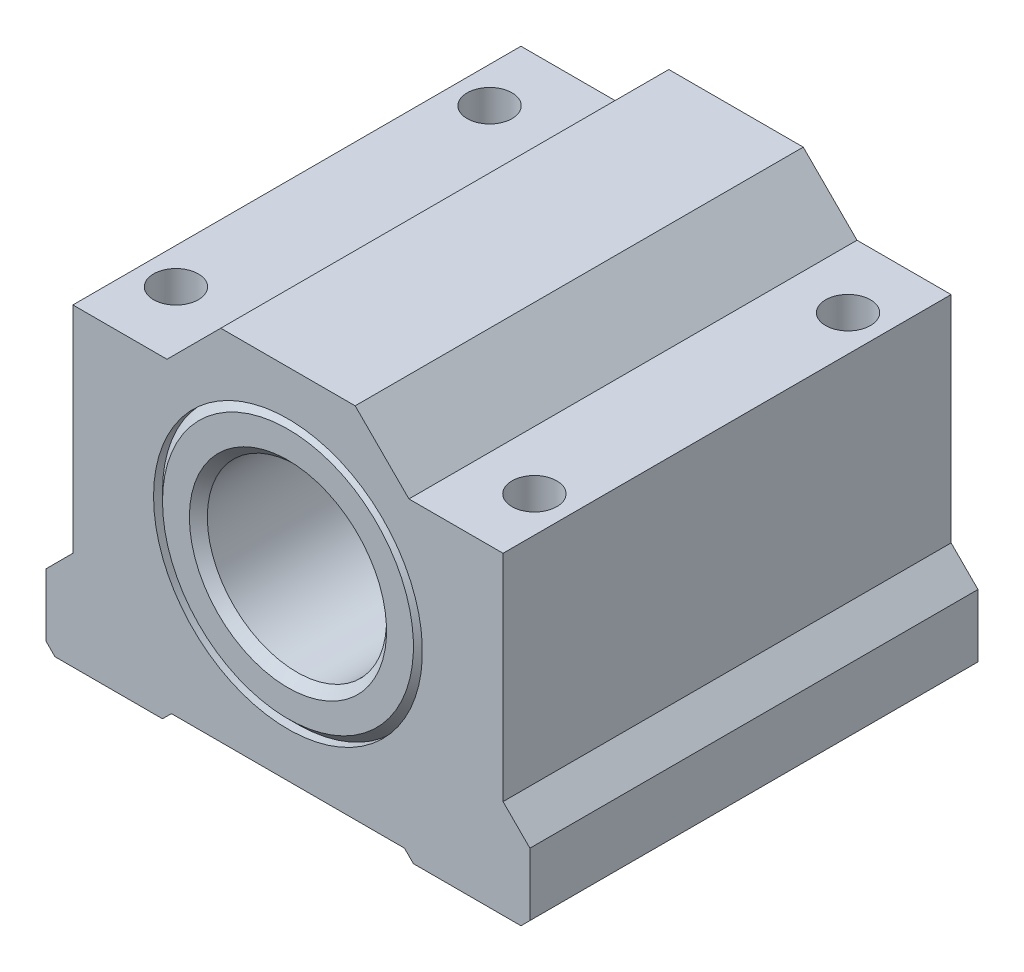
ISO-10303-21;
HEADER;
FILE_DESCRIPTION(('STEP AP214'),'2;1');
FILE_NAME('part.step','',(''),(''),'','','');
FILE_SCHEMA(('AUTOMOTIVE_DESIGN { 1 0 10303 214 1 1 1 1 }'));
ENDSEC;
DATA;
#1=APPLICATION_CONTEXT('core data for automotive mechanical design processes');
#2=APPLICATION_PROTOCOL_DEFINITION('international standard','automotive_design',2000,#1);
#3=PRODUCT_CONTEXT('',#1,'mechanical');
#4=PRODUCT('Part','Part','',(#3));
#5=PRODUCT_RELATED_PRODUCT_CATEGORY('part','',(#4));
#6=PRODUCT_DEFINITION_FORMATION('','',#4);
#7=PRODUCT_DEFINITION_CONTEXT('part definition',#1,'design');
#8=PRODUCT_DEFINITION('design','',#6,#7);
#9=PRODUCT_DEFINITION_SHAPE('','',#8);
#10=(LENGTH_UNIT() NAMED_UNIT(*) SI_UNIT(.MILLI.,.METRE.));
#11=(NAMED_UNIT(*) PLANE_ANGLE_UNIT() SI_UNIT($,.RADIAN.));
#12=(NAMED_UNIT(*) SI_UNIT($,.STERADIAN.) SOLID_ANGLE_UNIT());
#13=UNCERTAINTY_MEASURE_WITH_UNIT(LENGTH_MEASURE(1.E-05),#10,'distance_accuracy_value','');
#14=(GEOMETRIC_REPRESENTATION_CONTEXT(3) GLOBAL_UNCERTAINTY_ASSIGNED_CONTEXT((#13)) GLOBAL_UNIT_ASSIGNED_CONTEXT((#10,
#11,#12)) REPRESENTATION_CONTEXT('',''));
#15=CARTESIAN_POINT('',(0.,0.,0.));
#16=DIRECTION('',(0.,0.,1.));
#17=DIRECTION('',(1.,0.,0.));
#18=AXIS2_PLACEMENT_3D('',#15,#16,#17);
#19=CARTESIAN_POINT('',(0.,3.00000000000001,50.));
#20=DIRECTION('',(0.,0.,-1.));
#21=DIRECTION('',(-1.,0.,0.));
#22=AXIS2_PLACEMENT_3D('',#19,#20,#21);
#23=CYLINDRICAL_SURFACE('',#22,15.);
#24=CARTESIAN_POINT('',(0.,3.00000000000001,1.00000000000001));
#25=DIRECTION('',(0.,0.,-1.));
#26=DIRECTION('',(-1.,0.,0.));
#27=AXIS2_PLACEMENT_3D('',#24,#25,#26);
#28=CIRCLE('',#27,15.);
#29=CARTESIAN_POINT('',(-15.,3.00000000000001,1.00000000000001));
#30=VERTEX_POINT('',#29);
#31=EDGE_CURVE('E62',#30,#30,#28,.F.);
#32=ORIENTED_EDGE('',*,*,#31,.T.);
#33=EDGE_LOOP('',(#32));
#34=FACE_BOUND('',#33,.T.);
#35=CARTESIAN_POINT('',(0.,3.00000000000001,49.));
#36=DIRECTION('',(0.,0.,-1.));
#37=DIRECTION('',(-1.,0.,0.));
#38=AXIS2_PLACEMENT_3D('',#35,#36,#37);
#39=CIRCLE('',#38,15.);
#40=CARTESIAN_POINT('',(-15.,3.00000000000001,49.));
#41=VERTEX_POINT('',#40);
#42=EDGE_CURVE('E65',#41,#41,#39,.T.);
#43=ORIENTED_EDGE('',*,*,#42,.T.);
#44=EDGE_LOOP('',(#43));
#45=FACE_BOUND('',#44,.T.);
#46=ADVANCED_FACE('F42',(#34,#45),#23,.T.);
#47=CARTESIAN_POINT('',(0.,3.00000000000001,50.));
#48=DIRECTION('',(0.,0.,-1.));
#49=DIRECTION('',(-1.,0.,0.));
#50=AXIS2_PLACEMENT_3D('',#47,#48,#49);
#51=PLANE('',#50);
#52=CARTESIAN_POINT('',(0.,3.00000000000001,50.));
#53=DIRECTION('',(0.,0.,-1.));
#54=DIRECTION('',(-1.,0.,0.));
#55=AXIS2_PLACEMENT_3D('',#52,#53,#54);
#56=CIRCLE('',#55,11.);
#57=CARTESIAN_POINT('',(-11.,3.00000000000001,50.));
#58=VERTEX_POINT('',#57);
#59=EDGE_CURVE('E11',#58,#58,#56,.T.);
#60=ORIENTED_EDGE('',*,*,#59,.T.);
#61=EDGE_LOOP('',(#60));
#62=FACE_BOUND('',#61,.T.);
#63=CARTESIAN_POINT('',(0.,3.00000000000001,50.));
#64=DIRECTION('',(0.,0.,-1.));
#65=DIRECTION('',(-1.,0.,0.));
#66=AXIS2_PLACEMENT_3D('',#63,#64,#65);
#67=CIRCLE('',#66,14.);
#68=CARTESIAN_POINT('',(-14.,3.00000000000001,50.));
#69=VERTEX_POINT('',#68);
#70=EDGE_CURVE('E49',#69,#69,#67,.F.);
#71=ORIENTED_EDGE('',*,*,#70,.T.);
#72=EDGE_LOOP('',(#71));
#73=FACE_BOUND('',#72,.T.);
#74=ADVANCED_FACE('F98',(#62,#73),#51,.F.);
#75=CARTESIAN_POINT('',(0.,3.00000000000001,0.));
#76=DIRECTION('',(0.,0.,-1.));
#77=DIRECTION('',(-1.,0.,0.));
#78=AXIS2_PLACEMENT_3D('',#75,#76,#77);
#79=PLANE('',#78);
#80=CARTESIAN_POINT('',(0.,3.00000000000001,0.));
#81=DIRECTION('',(0.,0.,-1.));
#82=DIRECTION('',(-1.,0.,0.));
#83=AXIS2_PLACEMENT_3D('',#80,#81,#82);
#84=CIRCLE('',#83,14.);
#85=CARTESIAN_POINT('',(-14.,3.00000000000001,0.));
#86=VERTEX_POINT('',#85);
#87=EDGE_CURVE('E68',#86,#86,#84,.T.);
#88=ORIENTED_EDGE('',*,*,#87,.T.);
#89=EDGE_LOOP('',(#88));
#90=FACE_BOUND('',#89,.T.);
#91=CARTESIAN_POINT('',(0.,3.00000000000001,0.));
#92=DIRECTION('',(0.,0.,-1.));
#93=DIRECTION('',(-1.,0.,0.));
#94=AXIS2_PLACEMENT_3D('',#91,#92,#93);
#95=CIRCLE('',#94,11.);
#96=CARTESIAN_POINT('',(-11.,3.00000000000001,0.));
#97=VERTEX_POINT('',#96);
#98=EDGE_CURVE('E71',#97,#97,#95,.F.);
#99=ORIENTED_EDGE('',*,*,#98,.T.);
#100=EDGE_LOOP('',(#99));
#101=FACE_BOUND('',#100,.T.);
#102=ADVANCED_FACE('F75',(#90,#101),#79,.T.);
#103=CARTESIAN_POINT('',(0.,3.00000000000001,50.));
#104=DIRECTION('',(0.,0.,-1.));
#105=DIRECTION('',(-1.,0.,0.));
#106=AXIS2_PLACEMENT_3D('',#103,#104,#105);
#107=CYLINDRICAL_SURFACE('',#106,10.);
#108=CARTESIAN_POINT('',(0.,3.00000000000001,1.00000000000001));
#109=DIRECTION('',(0.,0.,-1.));
#110=DIRECTION('',(-1.,0.,0.));
#111=AXIS2_PLACEMENT_3D('',#108,#109,#110);
#112=CIRCLE('',#111,10.);
#113=CARTESIAN_POINT('',(-10.,3.00000000000001,1.00000000000001));
#114=VERTEX_POINT('',#113);
#115=EDGE_CURVE('E53',#114,#114,#112,.T.);
#116=ORIENTED_EDGE('',*,*,#115,.T.);
#117=EDGE_LOOP('',(#116));
#118=FACE_BOUND('',#117,.T.);
#119=CARTESIAN_POINT('',(0.,3.00000000000001,49.));
#120=DIRECTION('',(0.,0.,-1.));
#121=DIRECTION('',(-1.,0.,0.));
#122=AXIS2_PLACEMENT_3D('',#119,#120,#121);
#123=CIRCLE('',#122,10.);
#124=CARTESIAN_POINT('',(-10.,3.00000000000001,49.));
#125=VERTEX_POINT('',#124);
#126=EDGE_CURVE('E57',#125,#125,#123,.F.);
#127=ORIENTED_EDGE('',*,*,#126,.T.);
#128=EDGE_LOOP('',(#127));
#129=FACE_BOUND('',#128,.T.);
#130=ADVANCED_FACE('F85',(#118,#129),#107,.F.);
#131=CARTESIAN_POINT('',(0.,3.00000000000001,0.));
#132=DIRECTION('',(0.,0.,1.));
#133=DIRECTION('',(1.,0.,0.));
#134=AXIS2_PLACEMENT_3D('',#131,#132,#133);
#135=CONICAL_SURFACE('',#134,14.,0.785398163397449);
#136=ORIENTED_EDGE('',*,*,#31,.F.);
#137=EDGE_LOOP('',(#136));
#138=FACE_BOUND('',#137,.T.);
#139=ORIENTED_EDGE('',*,*,#87,.F.);
#140=EDGE_LOOP('',(#139));
#141=FACE_BOUND('',#140,.T.);
#142=ADVANCED_FACE('F81',(#138,#141),#135,.T.);
#143=CARTESIAN_POINT('',(0.,3.00000000000001,1.00000000000001));
#144=DIRECTION('',(0.,0.,-1.));
#145=DIRECTION('',(-1.,0.,0.));
#146=AXIS2_PLACEMENT_3D('',#143,#144,#145);
#147=CONICAL_SURFACE('',#146,10.,0.785398163397449);
#148=ORIENTED_EDGE('',*,*,#98,.F.);
#149=EDGE_LOOP('',(#148));
#150=FACE_BOUND('',#149,.T.);
#151=ORIENTED_EDGE('',*,*,#115,.F.);
#152=EDGE_LOOP('',(#151));
#153=FACE_BOUND('',#152,.T.);
#154=ADVANCED_FACE('F77',(#150,#153),#147,.F.);
#155=CARTESIAN_POINT('',(0.,3.00000000000001,50.));
#156=DIRECTION('',(0.,0.,1.));
#157=DIRECTION('',(1.,0.,0.));
#158=AXIS2_PLACEMENT_3D('',#155,#156,#157);
#159=CONICAL_SURFACE('',#158,11.,0.785398163397449);
#160=ORIENTED_EDGE('',*,*,#126,.F.);
#161=EDGE_LOOP('',(#160));
#162=FACE_BOUND('',#161,.T.);
#163=ORIENTED_EDGE('',*,*,#59,.F.);
#164=EDGE_LOOP('',(#163));
#165=FACE_BOUND('',#164,.T.);
#166=ADVANCED_FACE('F80',(#162,#165),#159,.F.);
#167=CARTESIAN_POINT('',(0.,3.00000000000001,49.));
#168=DIRECTION('',(0.,0.,-1.));
#169=DIRECTION('',(-1.,0.,0.));
#170=AXIS2_PLACEMENT_3D('',#167,#168,#169);
#171=CONICAL_SURFACE('',#170,15.,0.785398163397452);
#172=ORIENTED_EDGE('',*,*,#70,.F.);
#173=EDGE_LOOP('',(#172));
#174=FACE_BOUND('',#173,.T.);
#175=ORIENTED_EDGE('',*,*,#42,.F.);
#176=EDGE_LOOP('',(#175));
#177=FACE_BOUND('',#176,.T.);
#178=ADVANCED_FACE('F44',(#174,#177),#171,.T.);
#179=CLOSED_SHELL('',(#46,#74,#102,#130,#142,#154,#166,#178));
#180=MANIFOLD_SOLID_BREP('B2',#179);
#181=CARTESIAN_POINT('',(-24.,17.,50.));
#182=DIRECTION('',(0.,-1.,0.));
#183=DIRECTION('',(0.,0.,-1.));
#184=AXIS2_PLACEMENT_3D('',#181,#182,#183);
#185=PLANE('',#184);
#186=CARTESIAN_POINT('',(-20.,17.,7.5));
#187=DIRECTION('',(0.,-1.,0.));
#188=DIRECTION('',(0.,0.,-1.));
#189=AXIS2_PLACEMENT_3D('',#186,#187,#188);
#190=CIRCLE('',#189,2.5);
#191=CARTESIAN_POINT('',(-20.,17.,5.));
#192=VERTEX_POINT('',#191);
#193=EDGE_CURVE('E818',#192,#192,#190,.T.);
#194=ORIENTED_EDGE('',*,*,#193,.T.);
#195=EDGE_LOOP('',(#194));
#196=FACE_BOUND('',#195,.T.);
#197=CARTESIAN_POINT('',(-20.,17.,42.5));
#198=DIRECTION('',(0.,-1.,0.));
#199=DIRECTION('',(0.,0.,-1.));
#200=AXIS2_PLACEMENT_3D('',#197,#198,#199);
#201=CIRCLE('',#200,2.5);
#202=CARTESIAN_POINT('',(-20.,17.,40.));
#203=VERTEX_POINT('',#202);
#204=EDGE_CURVE('E445',#203,#203,#201,.T.);
#205=ORIENTED_EDGE('',*,*,#204,.T.);
#206=EDGE_LOOP('',(#205));
#207=FACE_BOUND('',#206,.T.);
#208=DIRECTION('',(0.,0.,1.));
#209=VECTOR('',#208,1.);
#210=CARTESIAN_POINT('',(-13.5,17.,0.));
#211=LINE('',#210,#209);
#212=CARTESIAN_POINT('',(-13.5,17.,0.));
#213=VERTEX_POINT('',#212);
#214=CARTESIAN_POINT('',(-13.5,17.,50.));
#215=VERTEX_POINT('',#214);
#216=EDGE_CURVE('E300',#213,#215,#211,.T.);
#217=ORIENTED_EDGE('',*,*,#216,.F.);
#218=DIRECTION('',(-1.,0.,0.));
#219=VECTOR('',#218,1.);
#220=CARTESIAN_POINT('',(-24.,17.,0.));
#221=LINE('',#220,#219);
#222=CARTESIAN_POINT('',(-24.,17.,0.));
#223=VERTEX_POINT('',#222);
#224=EDGE_CURVE('E312',#213,#223,#221,.T.);
#225=ORIENTED_EDGE('',*,*,#224,.T.);
#226=DIRECTION('',(0.,0.,-1.));
#227=VECTOR('',#226,1.);
#228=CARTESIAN_POINT('',(-24.,17.,50.));
#229=LINE('',#228,#227);
#230=CARTESIAN_POINT('',(-24.,17.,50.));
#231=VERTEX_POINT('',#230);
#232=EDGE_CURVE('E344',#231,#223,#229,.T.);
#233=ORIENTED_EDGE('',*,*,#232,.F.);
#234=DIRECTION('',(-1.,0.,0.));
#235=VECTOR('',#234,1.);
#236=CARTESIAN_POINT('',(-24.,17.,50.));
#237=LINE('',#236,#235);
#238=EDGE_CURVE('E314',#215,#231,#237,.T.);
#239=ORIENTED_EDGE('',*,*,#238,.F.);
#240=EDGE_LOOP('',(#217,#225,#233,#239));
#241=FACE_BOUND('',#240,.T.);
#242=ADVANCED_FACE('F169',(#196,#207,#241),#185,.F.);
#243=CARTESIAN_POINT('',(24.,-17.,50.));
#244=DIRECTION('',(-1.,0.,0.));
#245=DIRECTION('',(0.,0.,1.));
#246=AXIS2_PLACEMENT_3D('',#243,#244,#245);
#247=PLANE('',#246);
#248=DIRECTION('',(0.,1.,0.));
#249=VECTOR('',#248,1.);
#250=CARTESIAN_POINT('',(24.,-17.,50.));
#251=LINE('',#250,#249);
#252=CARTESIAN_POINT('',(24.,-6.99999999999998,50.));
#253=VERTEX_POINT('',#252);
#254=CARTESIAN_POINT('',(24.,17.,50.));
#255=VERTEX_POINT('',#254);
#256=EDGE_CURVE('E343',#253,#255,#251,.T.);
#257=ORIENTED_EDGE('',*,*,#256,.F.);
#258=DIRECTION('',(0.,0.,-1.));
#259=VECTOR('',#258,1.);
#260=CARTESIAN_POINT('',(24.,-6.99999999999998,50.));
#261=LINE('',#260,#259);
#262=CARTESIAN_POINT('',(24.,-6.99999999999998,0.));
#263=VERTEX_POINT('',#262);
#264=EDGE_CURVE('E505',#253,#263,#261,.T.);
#265=ORIENTED_EDGE('',*,*,#264,.T.);
#266=DIRECTION('',(0.,1.,0.));
#267=VECTOR('',#266,1.);
#268=CARTESIAN_POINT('',(24.,-17.,0.));
#269=LINE('',#268,#267);
#270=CARTESIAN_POINT('',(24.,17.,0.));
#271=VERTEX_POINT('',#270);
#272=EDGE_CURVE('E323',#263,#271,#269,.T.);
#273=ORIENTED_EDGE('',*,*,#272,.T.);
#274=DIRECTION('',(0.,0.,-1.));
#275=VECTOR('',#274,1.);
#276=CARTESIAN_POINT('',(24.,17.,50.));
#277=LINE('',#276,#275);
#278=EDGE_CURVE('E345',#255,#271,#277,.T.);
#279=ORIENTED_EDGE('',*,*,#278,.F.);
#280=EDGE_LOOP('',(#257,#265,#273,#279));
#281=FACE_BOUND('',#280,.T.);
#282=ADVANCED_FACE('F476',(#281),#247,.F.);
#283=CARTESIAN_POINT('',(20.,17.,42.5));
#284=DIRECTION('',(0.,-1.,0.));
#285=DIRECTION('',(0.,0.,-1.));
#286=AXIS2_PLACEMENT_3D('',#283,#284,#285);
#287=CIRCLE('',#286,2.5);
#288=CARTESIAN_POINT('',(20.,17.,40.));
#289=VERTEX_POINT('',#288);
#290=EDGE_CURVE('E497',#289,#289,#287,.T.);
#291=ORIENTED_EDGE('',*,*,#290,.T.);
#292=EDGE_LOOP('',(#291));
#293=FACE_BOUND('',#292,.T.);
#294=CARTESIAN_POINT('',(20.,17.,7.5));
#295=DIRECTION('',(0.,-1.,0.));
#296=DIRECTION('',(0.,0.,-1.));
#297=AXIS2_PLACEMENT_3D('',#294,#295,#296);
#298=CIRCLE('',#297,2.5);
#299=CARTESIAN_POINT('',(20.,17.,5.));
#300=VERTEX_POINT('',#299);
#301=EDGE_CURVE('E500',#300,#300,#298,.T.);
#302=ORIENTED_EDGE('',*,*,#301,.T.);
#303=EDGE_LOOP('',(#302));
#304=FACE_BOUND('',#303,.T.);
#305=CARTESIAN_POINT('',(13.5,17.,0.));
#306=VERTEX_POINT('',#305);
#307=EDGE_CURVE('E322',#271,#306,#221,.T.);
#308=ORIENTED_EDGE('',*,*,#307,.T.);
#309=DIRECTION('',(0.,0.,1.));
#310=VECTOR('',#309,1.);
#311=CARTESIAN_POINT('',(13.5,17.,0.));
#312=LINE('',#311,#310);
#313=CARTESIAN_POINT('',(13.5,17.,50.));
#314=VERTEX_POINT('',#313);
#315=EDGE_CURVE('E315',#306,#314,#312,.T.);
#316=ORIENTED_EDGE('',*,*,#315,.T.);
#317=EDGE_CURVE('E332',#255,#314,#237,.T.);
#318=ORIENTED_EDGE('',*,*,#317,.F.);
#319=ORIENTED_EDGE('',*,*,#278,.T.);
#320=EDGE_LOOP('',(#308,#316,#318,#319));
#321=FACE_BOUND('',#320,.T.);
#322=ADVANCED_FACE('F479',(#293,#304,#321),#185,.F.);
#323=CARTESIAN_POINT('',(-24.,-17.,50.));
#324=DIRECTION('',(1.,0.,0.));
#325=DIRECTION('',(0.,0.,-1.));
#326=AXIS2_PLACEMENT_3D('',#323,#324,#325);
#327=PLANE('',#326);
#328=DIRECTION('',(0.,-1.,0.));
#329=VECTOR('',#328,1.);
#330=CARTESIAN_POINT('',(-24.,-17.,0.));
#331=LINE('',#330,#329);
#332=CARTESIAN_POINT('',(-24.,-6.99999999999999,0.));
#333=VERTEX_POINT('',#332);
#334=EDGE_CURVE('E321',#223,#333,#331,.T.);
#335=ORIENTED_EDGE('',*,*,#334,.T.);
#336=DIRECTION('',(0.,0.,1.));
#337=VECTOR('',#336,1.);
#338=CARTESIAN_POINT('',(-24.,-6.99999999999999,50.));
#339=LINE('',#338,#337);
#340=CARTESIAN_POINT('',(-24.,-6.99999999999999,50.));
#341=VERTEX_POINT('',#340);
#342=EDGE_CURVE('E327',#333,#341,#339,.T.);
#343=ORIENTED_EDGE('',*,*,#342,.T.);
#344=DIRECTION('',(0.,-1.,0.));
#345=VECTOR('',#344,1.);
#346=CARTESIAN_POINT('',(-24.,-17.,50.));
#347=LINE('',#346,#345);
#348=EDGE_CURVE('E411',#231,#341,#347,.T.);
#349=ORIENTED_EDGE('',*,*,#348,.F.);
#350=ORIENTED_EDGE('',*,*,#232,.T.);
#351=EDGE_LOOP('',(#335,#343,#349,#350));
#352=FACE_BOUND('',#351,.T.);
#353=ADVANCED_FACE('F399',(#352),#327,.F.);
#354=CARTESIAN_POINT('',(-24.,-17.,50.));
#355=DIRECTION('',(0.,1.,0.));
#356=DIRECTION('',(0.,0.,1.));
#357=AXIS2_PLACEMENT_3D('',#354,#355,#356);
#358=PLANE('',#357);
#359=DIRECTION('',(1.,0.,0.));
#360=VECTOR('',#359,1.);
#361=CARTESIAN_POINT('',(-24.,-17.,0.));
#362=LINE('',#361,#360);
#363=CARTESIAN_POINT('',(-13.,-17.,0.));
#364=VERTEX_POINT('',#363);
#365=CARTESIAN_POINT('',(13.,-17.,0.));
#366=VERTEX_POINT('',#365);
#367=EDGE_CURVE('E340',#364,#366,#362,.T.);
#368=ORIENTED_EDGE('',*,*,#367,.T.);
#369=DIRECTION('',(0.,0.,1.));
#370=VECTOR('',#369,1.);
#371=CARTESIAN_POINT('',(13.,-17.,50.));
#372=LINE('',#371,#370);
#373=CARTESIAN_POINT('',(13.,-17.,50.));
#374=VERTEX_POINT('',#373);
#375=EDGE_CURVE('E517',#366,#374,#372,.T.);
#376=ORIENTED_EDGE('',*,*,#375,.T.);
#377=DIRECTION('',(1.,0.,0.));
#378=VECTOR('',#377,1.);
#379=CARTESIAN_POINT('',(-24.,-17.,50.));
#380=LINE('',#379,#378);
#381=CARTESIAN_POINT('',(-13.,-17.,50.));
#382=VERTEX_POINT('',#381);
#383=EDGE_CURVE('E346',#382,#374,#380,.T.);
#384=ORIENTED_EDGE('',*,*,#383,.F.);
#385=DIRECTION('',(0.,0.,-1.));
#386=VECTOR('',#385,1.);
#387=CARTESIAN_POINT('',(-13.,-17.,50.));
#388=LINE('',#387,#386);
#389=EDGE_CURVE('E403',#382,#364,#388,.T.);
#390=ORIENTED_EDGE('',*,*,#389,.T.);
#391=EDGE_LOOP('',(#368,#376,#384,#390));
#392=FACE_BOUND('',#391,.T.);
#393=ADVANCED_FACE('F493',(#392),#358,.F.);
#394=CARTESIAN_POINT('',(0.,0.,50.));
#395=DIRECTION('',(0.,0.,-1.));
#396=DIRECTION('',(-1.,0.,0.));
#397=AXIS2_PLACEMENT_3D('',#394,#395,#396);
#398=PLANE('',#397);
#399=CARTESIAN_POINT('',(0.,3.00000000000001,50.));
#400=DIRECTION('',(0.,0.,-1.));
#401=DIRECTION('',(-1.,0.,0.));
#402=AXIS2_PLACEMENT_3D('',#399,#400,#401);
#403=CIRCLE('',#402,15.);
#404=CARTESIAN_POINT('',(-15.,3.00000000000001,50.));
#405=VERTEX_POINT('',#404);
#406=EDGE_CURVE('E436',#405,#405,#403,.T.);
#407=ORIENTED_EDGE('',*,*,#406,.T.);
#408=EDGE_LOOP('',(#407));
#409=FACE_BOUND('',#408,.T.);
#410=ORIENTED_EDGE('',*,*,#348,.T.);
#411=DIRECTION('',(0.707106781186547,0.707106781186548,0.));
#412=VECTOR('',#411,1.);
#413=CARTESIAN_POINT('',(-24.,-6.99999999999999,50.));
#414=LINE('',#413,#412);
#415=CARTESIAN_POINT('',(-27.,-9.99999999999999,50.));
#416=VERTEX_POINT('',#415);
#417=EDGE_CURVE('E390',#341,#416,#414,.F.);
#418=ORIENTED_EDGE('',*,*,#417,.T.);
#419=DIRECTION('',(0.,-1.,0.));
#420=VECTOR('',#419,1.);
#421=CARTESIAN_POINT('',(-27.,-6.99999999999999,50.));
#422=LINE('',#421,#420);
#423=CARTESIAN_POINT('',(-27.,-17.,50.));
#424=VERTEX_POINT('',#423);
#425=EDGE_CURVE('E520',#416,#424,#422,.T.);
#426=ORIENTED_EDGE('',*,*,#425,.T.);
#427=DIRECTION('',(-0.707106781186548,0.707106781186548,0.));
#428=VECTOR('',#427,1.);
#429=CARTESIAN_POINT('',(-27.,-17.,50.));
#430=LINE('',#429,#428);
#431=CARTESIAN_POINT('',(-26.,-18.,50.));
#432=VERTEX_POINT('',#431);
#433=EDGE_CURVE('E365',#424,#432,#430,.F.);
#434=ORIENTED_EDGE('',*,*,#433,.T.);
#435=DIRECTION('',(1.,0.,0.));
#436=VECTOR('',#435,1.);
#437=CARTESIAN_POINT('',(-27.,-18.,50.));
#438=LINE('',#437,#436);
#439=CARTESIAN_POINT('',(-14.,-18.,50.));
#440=VERTEX_POINT('',#439);
#441=EDGE_CURVE('E522',#432,#440,#438,.T.);
#442=ORIENTED_EDGE('',*,*,#441,.T.);
#443=DIRECTION('',(-0.707106781186545,-0.70710678118655,0.));
#444=VECTOR('',#443,1.);
#445=CARTESIAN_POINT('',(-14.,-18.,50.));
#446=LINE('',#445,#444);
#447=EDGE_CURVE('E353',#440,#382,#446,.F.);
#448=ORIENTED_EDGE('',*,*,#447,.T.);
#449=ORIENTED_EDGE('',*,*,#383,.T.);
#450=DIRECTION('',(-0.70710678118655,0.707106781186545,0.));
#451=VECTOR('',#450,1.);
#452=CARTESIAN_POINT('',(13.,-17.,50.));
#453=LINE('',#452,#451);
#454=CARTESIAN_POINT('',(14.,-18.,50.));
#455=VERTEX_POINT('',#454);
#456=EDGE_CURVE('E356',#374,#455,#453,.F.);
#457=ORIENTED_EDGE('',*,*,#456,.T.);
#458=DIRECTION('',(1.,0.,0.));
#459=VECTOR('',#458,1.);
#460=CARTESIAN_POINT('',(13.,-18.,50.));
#461=LINE('',#460,#459);
#462=CARTESIAN_POINT('',(26.,-18.,50.));
#463=VERTEX_POINT('',#462);
#464=EDGE_CURVE('E451',#455,#463,#461,.T.);
#465=ORIENTED_EDGE('',*,*,#464,.T.);
#466=DIRECTION('',(-0.707106781186545,-0.70710678118655,0.));
#467=VECTOR('',#466,1.);
#468=CARTESIAN_POINT('',(26.,-18.,50.));
#469=LINE('',#468,#467);
#470=CARTESIAN_POINT('',(27.,-17.,50.));
#471=VERTEX_POINT('',#470);
#472=EDGE_CURVE('E363',#463,#471,#469,.F.);
#473=ORIENTED_EDGE('',*,*,#472,.T.);
#474=DIRECTION('',(0.,1.,0.));
#475=VECTOR('',#474,1.);
#476=CARTESIAN_POINT('',(27.,-6.99999999999998,50.));
#477=LINE('',#476,#475);
#478=CARTESIAN_POINT('',(27.,-9.99999999999996,50.));
#479=VERTEX_POINT('',#478);
#480=EDGE_CURVE('E455',#471,#479,#477,.T.);
#481=ORIENTED_EDGE('',*,*,#480,.T.);
#482=DIRECTION('',(0.707106781186549,-0.707106781186546,0.));
#483=VECTOR('',#482,1.);
#484=CARTESIAN_POINT('',(27.,-9.99999999999996,50.));
#485=LINE('',#484,#483);
#486=EDGE_CURVE('E388',#479,#253,#485,.F.);
#487=ORIENTED_EDGE('',*,*,#486,.T.);
#488=ORIENTED_EDGE('',*,*,#256,.T.);
#489=ORIENTED_EDGE('',*,*,#317,.T.);
#490=DIRECTION('',(-0.707106781186548,0.707106781186547,0.));
#491=VECTOR('',#490,1.);
#492=CARTESIAN_POINT('',(13.5,17.,50.));
#493=LINE('',#492,#491);
#494=CARTESIAN_POINT('',(7.5,23.,50.));
#495=VERTEX_POINT('',#494);
#496=EDGE_CURVE('E414',#314,#495,#493,.T.);
#497=ORIENTED_EDGE('',*,*,#496,.T.);
#498=DIRECTION('',(-1.,0.,0.));
#499=VECTOR('',#498,1.);
#500=CARTESIAN_POINT('',(7.5,23.,50.));
#501=LINE('',#500,#499);
#502=CARTESIAN_POINT('',(-7.5,23.,50.));
#503=VERTEX_POINT('',#502);
#504=EDGE_CURVE('E307',#495,#503,#501,.T.);
#505=ORIENTED_EDGE('',*,*,#504,.T.);
#506=DIRECTION('',(-0.707106781186547,-0.707106781186548,0.));
#507=VECTOR('',#506,1.);
#508=CARTESIAN_POINT('',(-7.5,23.,50.));
#509=LINE('',#508,#507);
#510=EDGE_CURVE('E417',#503,#215,#509,.T.);
#511=ORIENTED_EDGE('',*,*,#510,.T.);
#512=ORIENTED_EDGE('',*,*,#238,.T.);
#513=EDGE_LOOP('',(#410,#418,#426,#434,#442,#448,#449,#457,#465,#473,#481,#487,#488,#489,#497,
#505,#511,#512));
#514=FACE_BOUND('',#513,.T.);
#515=ADVANCED_FACE('F462',(#409,#514),#398,.F.);
#516=CARTESIAN_POINT('',(0.,0.,0.));
#517=DIRECTION('',(0.,0.,-1.));
#518=DIRECTION('',(-1.,0.,0.));
#519=AXIS2_PLACEMENT_3D('',#516,#517,#518);
#520=PLANE('',#519);
#521=CARTESIAN_POINT('',(0.,3.00000000000001,0.));
#522=DIRECTION('',(0.,0.,-1.));
#523=DIRECTION('',(-1.,0.,0.));
#524=AXIS2_PLACEMENT_3D('',#521,#522,#523);
#525=CIRCLE('',#524,15.);
#526=CARTESIAN_POINT('',(-15.,3.00000000000001,0.));
#527=VERTEX_POINT('',#526);
#528=EDGE_CURVE('E440',#527,#527,#525,.T.);
#529=ORIENTED_EDGE('',*,*,#528,.F.);
#530=EDGE_LOOP('',(#529));
#531=FACE_BOUND('',#530,.T.);
#532=DIRECTION('',(0.,-1.,0.));
#533=VECTOR('',#532,1.);
#534=CARTESIAN_POINT('',(-27.,-6.99999999999999,0.));
#535=LINE('',#534,#533);
#536=CARTESIAN_POINT('',(-27.,-9.99999999999999,0.));
#537=VERTEX_POINT('',#536);
#538=CARTESIAN_POINT('',(-27.,-17.,0.));
#539=VERTEX_POINT('',#538);
#540=EDGE_CURVE('E394',#537,#539,#535,.T.);
#541=ORIENTED_EDGE('',*,*,#540,.F.);
#542=DIRECTION('',(-0.707106781186547,-0.707106781186548,0.));
#543=VECTOR('',#542,1.);
#544=CARTESIAN_POINT('',(-8.50000000000003,8.50000000000001,0.));
#545=LINE('',#544,#543);
#546=EDGE_CURVE('E177',#537,#333,#545,.F.);
#547=ORIENTED_EDGE('',*,*,#546,.T.);
#548=ORIENTED_EDGE('',*,*,#334,.F.);
#549=ORIENTED_EDGE('',*,*,#224,.F.);
#550=DIRECTION('',(-0.707106781186547,-0.707106781186548,0.));
#551=VECTOR('',#550,1.);
#552=CARTESIAN_POINT('',(-7.5,23.,0.));
#553=LINE('',#552,#551);
#554=CARTESIAN_POINT('',(-7.5,23.,0.));
#555=VERTEX_POINT('',#554);
#556=EDGE_CURVE('E296',#555,#213,#553,.T.);
#557=ORIENTED_EDGE('',*,*,#556,.F.);
#558=DIRECTION('',(-1.,0.,0.));
#559=VECTOR('',#558,1.);
#560=CARTESIAN_POINT('',(7.5,23.,0.));
#561=LINE('',#560,#559);
#562=CARTESIAN_POINT('',(7.5,23.,0.));
#563=VERTEX_POINT('',#562);
#564=EDGE_CURVE('E316',#563,#555,#561,.T.);
#565=ORIENTED_EDGE('',*,*,#564,.F.);
#566=DIRECTION('',(-0.707106781186548,0.707106781186547,0.));
#567=VECTOR('',#566,1.);
#568=CARTESIAN_POINT('',(13.5,17.,0.));
#569=LINE('',#568,#567);
#570=EDGE_CURVE('E306',#306,#563,#569,.T.);
#571=ORIENTED_EDGE('',*,*,#570,.F.);
#572=ORIENTED_EDGE('',*,*,#307,.F.);
#573=ORIENTED_EDGE('',*,*,#272,.F.);
#574=DIRECTION('',(-0.707106781186549,0.707106781186546,0.));
#575=VECTOR('',#574,1.);
#576=CARTESIAN_POINT('',(8.49999999999997,8.50000000000001,0.));
#577=LINE('',#576,#575);
#578=CARTESIAN_POINT('',(27.,-9.99999999999997,0.));
#579=VERTEX_POINT('',#578);
#580=EDGE_CURVE('E184',#263,#579,#577,.F.);
#581=ORIENTED_EDGE('',*,*,#580,.T.);
#582=DIRECTION('',(0.,1.,0.));
#583=VECTOR('',#582,1.);
#584=CARTESIAN_POINT('',(27.,-6.99999999999998,0.));
#585=LINE('',#584,#583);
#586=CARTESIAN_POINT('',(27.,-17.,0.));
#587=VERTEX_POINT('',#586);
#588=EDGE_CURVE('E511',#587,#579,#585,.T.);
#589=ORIENTED_EDGE('',*,*,#588,.F.);
#590=DIRECTION('',(0.707106781186545,0.70710678118655,0.));
#591=VECTOR('',#590,1.);
#592=CARTESIAN_POINT('',(22.0000000000001,-21.9999999999999,0.));
#593=LINE('',#592,#591);
#594=CARTESIAN_POINT('',(26.,-18.,0.));
#595=VERTEX_POINT('',#594);
#596=EDGE_CURVE('E376',#587,#595,#593,.F.);
#597=ORIENTED_EDGE('',*,*,#596,.T.);
#598=DIRECTION('',(1.,0.,0.));
#599=VECTOR('',#598,1.);
#600=CARTESIAN_POINT('',(13.,-18.,0.));
#601=LINE('',#600,#599);
#602=CARTESIAN_POINT('',(14.,-18.,0.));
#603=VERTEX_POINT('',#602);
#604=EDGE_CURVE('E431',#603,#595,#601,.T.);
#605=ORIENTED_EDGE('',*,*,#604,.F.);
#606=DIRECTION('',(0.70710678118655,-0.707106781186545,0.));
#607=VECTOR('',#606,1.);
#608=CARTESIAN_POINT('',(-2.00000000000004,-2.00000000000005,0.));
#609=LINE('',#608,#607);
#610=EDGE_CURVE('E374',#603,#366,#609,.F.);
#611=ORIENTED_EDGE('',*,*,#610,.T.);
#612=ORIENTED_EDGE('',*,*,#367,.F.);
#613=DIRECTION('',(0.707106781186545,0.70710678118655,0.));
#614=VECTOR('',#613,1.);
#615=CARTESIAN_POINT('',(1.99999999999995,-1.99999999999994,0.));
#616=LINE('',#615,#614);
#617=CARTESIAN_POINT('',(-14.,-18.,0.));
#618=VERTEX_POINT('',#617);
#619=EDGE_CURVE('E372',#364,#618,#616,.F.);
#620=ORIENTED_EDGE('',*,*,#619,.T.);
#621=DIRECTION('',(1.,0.,0.));
#622=VECTOR('',#621,1.);
#623=CARTESIAN_POINT('',(-27.,-18.,0.));
#624=LINE('',#623,#622);
#625=CARTESIAN_POINT('',(-26.,-18.,0.));
#626=VERTEX_POINT('',#625);
#627=EDGE_CURVE('E405',#626,#618,#624,.T.);
#628=ORIENTED_EDGE('',*,*,#627,.F.);
#629=DIRECTION('',(0.707106781186548,-0.707106781186548,0.));
#630=VECTOR('',#629,1.);
#631=CARTESIAN_POINT('',(-22.,-22.,0.));
#632=LINE('',#631,#630);
#633=EDGE_CURVE('E378',#626,#539,#632,.F.);
#634=ORIENTED_EDGE('',*,*,#633,.T.);
#635=EDGE_LOOP('',(#541,#547,#548,#549,#557,#565,#571,#572,#573,#581,#589,#597,#605,#611,#612,
#620,#628,#634));
#636=FACE_BOUND('',#635,.T.);
#637=ADVANCED_FACE('F319',(#531,#636),#520,.T.);
#638=CARTESIAN_POINT('',(-27.,-6.99999999999999,0.));
#639=DIRECTION('',(-1.,0.,0.));
#640=DIRECTION('',(0.,-1.,0.));
#641=AXIS2_PLACEMENT_3D('',#638,#639,#640);
#642=PLANE('',#641);
#643=ORIENTED_EDGE('',*,*,#425,.F.);
#644=DIRECTION('',(0.,0.,-1.));
#645=VECTOR('',#644,1.);
#646=CARTESIAN_POINT('',(-27.,-9.99999999999999,0.));
#647=LINE('',#646,#645);
#648=EDGE_CURVE('E192',#416,#537,#647,.T.);
#649=ORIENTED_EDGE('',*,*,#648,.T.);
#650=ORIENTED_EDGE('',*,*,#540,.T.);
#651=DIRECTION('',(0.,0.,1.));
#652=VECTOR('',#651,1.);
#653=CARTESIAN_POINT('',(-27.,-17.,0.));
#654=LINE('',#653,#652);
#655=EDGE_CURVE('E348',#539,#424,#654,.T.);
#656=ORIENTED_EDGE('',*,*,#655,.T.);
#657=EDGE_LOOP('',(#643,#649,#650,#656));
#658=FACE_BOUND('',#657,.T.);
#659=ADVANCED_FACE('F551',(#658),#642,.T.);
#660=CARTESIAN_POINT('',(-27.,-18.,0.));
#661=DIRECTION('',(0.,-1.,0.));
#662=DIRECTION('',(1.,0.,0.));
#663=AXIS2_PLACEMENT_3D('',#660,#661,#662);
#664=PLANE('',#663);
#665=CARTESIAN_POINT('',(-20.,-18.,7.5));
#666=DIRECTION('',(0.,-1.,0.));
#667=DIRECTION('',(1.,0.,0.));
#668=AXIS2_PLACEMENT_3D('',#665,#666,#667);
#669=CIRCLE('',#668,2.5);
#670=CARTESIAN_POINT('',(-17.5,-18.,7.5));
#671=VERTEX_POINT('',#670);
#672=EDGE_CURVE('E811',#671,#671,#669,.T.);
#673=ORIENTED_EDGE('',*,*,#672,.F.);
#674=EDGE_LOOP('',(#673));
#675=FACE_BOUND('',#674,.T.);
#676=CARTESIAN_POINT('',(-20.,-18.,42.5));
#677=DIRECTION('',(0.,-1.,0.));
#678=DIRECTION('',(1.,0.,0.));
#679=AXIS2_PLACEMENT_3D('',#676,#677,#678);
#680=CIRCLE('',#679,2.5);
#681=CARTESIAN_POINT('',(-17.5,-18.,42.5));
#682=VERTEX_POINT('',#681);
#683=EDGE_CURVE('E819',#682,#682,#680,.T.);
#684=ORIENTED_EDGE('',*,*,#683,.F.);
#685=EDGE_LOOP('',(#684));
#686=FACE_BOUND('',#685,.T.);
#687=ORIENTED_EDGE('',*,*,#441,.F.);
#688=DIRECTION('',(0.,0.,-1.));
#689=VECTOR('',#688,1.);
#690=CARTESIAN_POINT('',(-26.,-18.,0.));
#691=LINE('',#690,#689);
#692=EDGE_CURVE('E370',#432,#626,#691,.T.);
#693=ORIENTED_EDGE('',*,*,#692,.T.);
#694=ORIENTED_EDGE('',*,*,#627,.T.);
#695=DIRECTION('',(0.,0.,1.));
#696=VECTOR('',#695,1.);
#697=CARTESIAN_POINT('',(-14.,-18.,0.));
#698=LINE('',#697,#696);
#699=EDGE_CURVE('E367',#618,#440,#698,.T.);
#700=ORIENTED_EDGE('',*,*,#699,.T.);
#701=EDGE_LOOP('',(#687,#693,#694,#700));
#702=FACE_BOUND('',#701,.T.);
#703=ADVANCED_FACE('F532',(#675,#686,#702),#664,.T.);
#704=CARTESIAN_POINT('',(27.,-6.99999999999998,0.));
#705=DIRECTION('',(1.,0.,0.));
#706=DIRECTION('',(0.,1.,0.));
#707=AXIS2_PLACEMENT_3D('',#704,#705,#706);
#708=PLANE('',#707);
#709=ORIENTED_EDGE('',*,*,#588,.T.);
#710=DIRECTION('',(0.,0.,1.));
#711=VECTOR('',#710,1.);
#712=CARTESIAN_POINT('',(27.,-9.99999999999996,0.));
#713=LINE('',#712,#711);
#714=EDGE_CURVE('E40',#579,#479,#713,.T.);
#715=ORIENTED_EDGE('',*,*,#714,.T.);
#716=ORIENTED_EDGE('',*,*,#480,.F.);
#717=DIRECTION('',(0.,0.,-1.));
#718=VECTOR('',#717,1.);
#719=CARTESIAN_POINT('',(27.,-17.,0.));
#720=LINE('',#719,#718);
#721=EDGE_CURVE('E386',#471,#587,#720,.T.);
#722=ORIENTED_EDGE('',*,*,#721,.T.);
#723=EDGE_LOOP('',(#709,#715,#716,#722));
#724=FACE_BOUND('',#723,.T.);
#725=ADVANCED_FACE('F509',(#724),#708,.T.);
#726=CARTESIAN_POINT('',(13.,-18.,0.));
#727=DIRECTION('',(0.,-1.,0.));
#728=DIRECTION('',(0.,0.,-1.));
#729=AXIS2_PLACEMENT_3D('',#726,#727,#728);
#730=PLANE('',#729);
#731=CARTESIAN_POINT('',(20.,-18.,42.5));
#732=DIRECTION('',(0.,-1.,0.));
#733=DIRECTION('',(1.,0.,0.));
#734=AXIS2_PLACEMENT_3D('',#731,#732,#733);
#735=CIRCLE('',#734,2.5);
#736=CARTESIAN_POINT('',(22.5,-18.,42.5));
#737=VERTEX_POINT('',#736);
#738=EDGE_CURVE('E803',#737,#737,#735,.T.);
#739=ORIENTED_EDGE('',*,*,#738,.F.);
#740=EDGE_LOOP('',(#739));
#741=FACE_BOUND('',#740,.T.);
#742=CARTESIAN_POINT('',(20.,-18.,7.5));
#743=DIRECTION('',(0.,-1.,0.));
#744=DIRECTION('',(1.,0.,0.));
#745=AXIS2_PLACEMENT_3D('',#742,#743,#744);
#746=CIRCLE('',#745,2.5);
#747=CARTESIAN_POINT('',(22.5,-18.,7.5));
#748=VERTEX_POINT('',#747);
#749=EDGE_CURVE('E807',#748,#748,#746,.T.);
#750=ORIENTED_EDGE('',*,*,#749,.F.);
#751=EDGE_LOOP('',(#750));
#752=FACE_BOUND('',#751,.T.);
#753=ORIENTED_EDGE('',*,*,#604,.T.);
#754=DIRECTION('',(0.,0.,1.));
#755=VECTOR('',#754,1.);
#756=CARTESIAN_POINT('',(26.,-18.,0.));
#757=LINE('',#756,#755);
#758=EDGE_CURVE('E383',#595,#463,#757,.T.);
#759=ORIENTED_EDGE('',*,*,#758,.T.);
#760=ORIENTED_EDGE('',*,*,#464,.F.);
#761=DIRECTION('',(0.,0.,-1.));
#762=VECTOR('',#761,1.);
#763=CARTESIAN_POINT('',(14.,-18.,0.));
#764=LINE('',#763,#762);
#765=EDGE_CURVE('E381',#455,#603,#764,.T.);
#766=ORIENTED_EDGE('',*,*,#765,.T.);
#767=EDGE_LOOP('',(#753,#759,#760,#766));
#768=FACE_BOUND('',#767,.T.);
#769=ADVANCED_FACE('F472',(#741,#752,#768),#730,.T.);
#770=CARTESIAN_POINT('',(-7.5,23.,0.));
#771=DIRECTION('',(-0.707106781186548,0.707106781186547,0.));
#772=DIRECTION('',(-0.707106781186547,-0.707106781186548,0.));
#773=AXIS2_PLACEMENT_3D('',#770,#771,#772);
#774=PLANE('',#773);
#775=ORIENTED_EDGE('',*,*,#510,.F.);
#776=DIRECTION('',(0.,0.,1.));
#777=VECTOR('',#776,1.);
#778=CARTESIAN_POINT('',(-7.5,23.,0.));
#779=LINE('',#778,#777);
#780=EDGE_CURVE('E302',#555,#503,#779,.T.);
#781=ORIENTED_EDGE('',*,*,#780,.F.);
#782=ORIENTED_EDGE('',*,*,#556,.T.);
#783=ORIENTED_EDGE('',*,*,#216,.T.);
#784=EDGE_LOOP('',(#775,#781,#782,#783));
#785=FACE_BOUND('',#784,.T.);
#786=ADVANCED_FACE('F299',(#785),#774,.T.);
#787=CARTESIAN_POINT('',(7.5,23.,0.));
#788=DIRECTION('',(0.,1.,0.));
#789=DIRECTION('',(-1.,0.,0.));
#790=AXIS2_PLACEMENT_3D('',#787,#788,#789);
#791=PLANE('',#790);
#792=ORIENTED_EDGE('',*,*,#504,.F.);
#793=DIRECTION('',(0.,0.,1.));
#794=VECTOR('',#793,1.);
#795=CARTESIAN_POINT('',(7.5,23.,0.));
#796=LINE('',#795,#794);
#797=EDGE_CURVE('E423',#563,#495,#796,.T.);
#798=ORIENTED_EDGE('',*,*,#797,.F.);
#799=ORIENTED_EDGE('',*,*,#564,.T.);
#800=ORIENTED_EDGE('',*,*,#780,.T.);
#801=EDGE_LOOP('',(#792,#798,#799,#800));
#802=FACE_BOUND('',#801,.T.);
#803=ADVANCED_FACE('F463',(#802),#791,.T.);
#804=CARTESIAN_POINT('',(13.5,17.,0.));
#805=DIRECTION('',(0.707106781186547,0.707106781186548,0.));
#806=DIRECTION('',(-0.707106781186548,0.707106781186547,0.));
#807=AXIS2_PLACEMENT_3D('',#804,#805,#806);
#808=PLANE('',#807);
#809=ORIENTED_EDGE('',*,*,#496,.F.);
#810=ORIENTED_EDGE('',*,*,#315,.F.);
#811=ORIENTED_EDGE('',*,*,#570,.T.);
#812=ORIENTED_EDGE('',*,*,#797,.T.);
#813=EDGE_LOOP('',(#809,#810,#811,#812));
#814=FACE_BOUND('',#813,.T.);
#815=ADVANCED_FACE('F459',(#814),#808,.T.);
#816=CARTESIAN_POINT('',(0.,3.00000000000001,50.));
#817=DIRECTION('',(0.,0.,-1.));
#818=DIRECTION('',(-1.,0.,0.));
#819=AXIS2_PLACEMENT_3D('',#816,#817,#818);
#820=CYLINDRICAL_SURFACE('',#819,15.);
#821=ORIENTED_EDGE('',*,*,#406,.F.);
#822=EDGE_LOOP('',(#821));
#823=FACE_BOUND('',#822,.T.);
#824=ORIENTED_EDGE('',*,*,#528,.T.);
#825=EDGE_LOOP('',(#824));
#826=FACE_BOUND('',#825,.T.);
#827=ADVANCED_FACE('F470',(#823,#826),#820,.F.);
#828=CARTESIAN_POINT('',(-20.,32.,42.5));
#829=DIRECTION('',(0.,-1.,0.));
#830=DIRECTION('',(1.,0.,0.));
#831=AXIS2_PLACEMENT_3D('',#828,#829,#830);
#832=CYLINDRICAL_SURFACE('',#831,2.5);
#833=ORIENTED_EDGE('',*,*,#683,.T.);
#834=EDGE_LOOP('',(#833));
#835=FACE_BOUND('',#834,.T.);
#836=ORIENTED_EDGE('',*,*,#204,.F.);
#837=EDGE_LOOP('',(#836));
#838=FACE_BOUND('',#837,.T.);
#839=ADVANCED_FACE('F646',(#835,#838),#832,.F.);
#840=CARTESIAN_POINT('',(-20.,32.,7.5));
#841=DIRECTION('',(0.,-1.,0.));
#842=DIRECTION('',(1.,0.,0.));
#843=AXIS2_PLACEMENT_3D('',#840,#841,#842);
#844=CYLINDRICAL_SURFACE('',#843,2.5);
#845=ORIENTED_EDGE('',*,*,#672,.T.);
#846=EDGE_LOOP('',(#845));
#847=FACE_BOUND('',#846,.T.);
#848=ORIENTED_EDGE('',*,*,#193,.F.);
#849=EDGE_LOOP('',(#848));
#850=FACE_BOUND('',#849,.T.);
#851=ADVANCED_FACE('F628',(#847,#850),#844,.F.);
#852=CARTESIAN_POINT('',(20.,32.,7.5));
#853=DIRECTION('',(0.,-1.,0.));
#854=DIRECTION('',(1.,0.,0.));
#855=AXIS2_PLACEMENT_3D('',#852,#853,#854);
#856=CYLINDRICAL_SURFACE('',#855,2.5);
#857=ORIENTED_EDGE('',*,*,#749,.T.);
#858=EDGE_LOOP('',(#857));
#859=FACE_BOUND('',#858,.T.);
#860=ORIENTED_EDGE('',*,*,#301,.F.);
#861=EDGE_LOOP('',(#860));
#862=FACE_BOUND('',#861,.T.);
#863=ADVANCED_FACE('F622',(#859,#862),#856,.F.);
#864=CARTESIAN_POINT('',(20.,32.,42.5));
#865=DIRECTION('',(0.,-1.,0.));
#866=DIRECTION('',(1.,0.,0.));
#867=AXIS2_PLACEMENT_3D('',#864,#865,#866);
#868=CYLINDRICAL_SURFACE('',#867,2.5);
#869=ORIENTED_EDGE('',*,*,#738,.T.);
#870=EDGE_LOOP('',(#869));
#871=FACE_BOUND('',#870,.T.);
#872=ORIENTED_EDGE('',*,*,#290,.F.);
#873=EDGE_LOOP('',(#872));
#874=FACE_BOUND('',#873,.T.);
#875=ADVANCED_FACE('F627',(#871,#874),#868,.F.);
#876=CARTESIAN_POINT('',(-27.,-17.,0.));
#877=DIRECTION('',(0.707106781186547,0.707106781186547,0.));
#878=DIRECTION('',(0.,0.,1.));
#879=AXIS2_PLACEMENT_3D('',#876,#877,#878);
#880=PLANE('',#879);
#881=ORIENTED_EDGE('',*,*,#633,.F.);
#882=ORIENTED_EDGE('',*,*,#692,.F.);
#883=ORIENTED_EDGE('',*,*,#433,.F.);
#884=ORIENTED_EDGE('',*,*,#655,.F.);
#885=EDGE_LOOP('',(#881,#882,#883,#884));
#886=FACE_BOUND('',#885,.T.);
#887=ADVANCED_FACE('F537',(#886),#880,.F.);
#888=CARTESIAN_POINT('',(26.,-18.,0.));
#889=DIRECTION('',(-0.70710678118655,0.707106781186545,0.));
#890=DIRECTION('',(0.,0.,1.));
#891=AXIS2_PLACEMENT_3D('',#888,#889,#890);
#892=PLANE('',#891);
#893=ORIENTED_EDGE('',*,*,#596,.F.);
#894=ORIENTED_EDGE('',*,*,#721,.F.);
#895=ORIENTED_EDGE('',*,*,#472,.F.);
#896=ORIENTED_EDGE('',*,*,#758,.F.);
#897=EDGE_LOOP('',(#893,#894,#895,#896));
#898=FACE_BOUND('',#897,.T.);
#899=ADVANCED_FACE('F588',(#898),#892,.F.);
#900=CARTESIAN_POINT('',(13.,-17.,0.));
#901=DIRECTION('',(0.707106781186545,0.70710678118655,0.));
#902=DIRECTION('',(0.,0.,1.));
#903=AXIS2_PLACEMENT_3D('',#900,#901,#902);
#904=PLANE('',#903);
#905=ORIENTED_EDGE('',*,*,#610,.F.);
#906=ORIENTED_EDGE('',*,*,#765,.F.);
#907=ORIENTED_EDGE('',*,*,#456,.F.);
#908=ORIENTED_EDGE('',*,*,#375,.F.);
#909=EDGE_LOOP('',(#905,#906,#907,#908));
#910=FACE_BOUND('',#909,.T.);
#911=ADVANCED_FACE('F549',(#910),#904,.F.);
#912=CARTESIAN_POINT('',(-14.,-18.,0.));
#913=DIRECTION('',(-0.70710678118655,0.707106781186545,0.));
#914=DIRECTION('',(0.,0.,1.));
#915=AXIS2_PLACEMENT_3D('',#912,#913,#914);
#916=PLANE('',#915);
#917=ORIENTED_EDGE('',*,*,#619,.F.);
#918=ORIENTED_EDGE('',*,*,#389,.F.);
#919=ORIENTED_EDGE('',*,*,#447,.F.);
#920=ORIENTED_EDGE('',*,*,#699,.F.);
#921=EDGE_LOOP('',(#917,#918,#919,#920));
#922=FACE_BOUND('',#921,.T.);
#923=ADVANCED_FACE('F541',(#922),#916,.F.);
#924=CARTESIAN_POINT('',(-24.,-6.99999999999999,0.));
#925=DIRECTION('',(0.707106781186548,-0.707106781186547,0.));
#926=DIRECTION('',(0.,0.,1.));
#927=AXIS2_PLACEMENT_3D('',#924,#925,#926);
#928=PLANE('',#927);
#929=ORIENTED_EDGE('',*,*,#546,.F.);
#930=ORIENTED_EDGE('',*,*,#648,.F.);
#931=ORIENTED_EDGE('',*,*,#417,.F.);
#932=ORIENTED_EDGE('',*,*,#342,.F.);
#933=EDGE_LOOP('',(#929,#930,#931,#932));
#934=FACE_BOUND('',#933,.T.);
#935=ADVANCED_FACE('F402',(#934),#928,.F.);
#936=CARTESIAN_POINT('',(27.,-9.99999999999996,0.));
#937=DIRECTION('',(-0.707106781186546,-0.707106781186549,0.));
#938=DIRECTION('',(0.,0.,1.));
#939=AXIS2_PLACEMENT_3D('',#936,#937,#938);
#940=PLANE('',#939);
#941=ORIENTED_EDGE('',*,*,#580,.F.);
#942=ORIENTED_EDGE('',*,*,#264,.F.);
#943=ORIENTED_EDGE('',*,*,#486,.F.);
#944=ORIENTED_EDGE('',*,*,#714,.F.);
#945=EDGE_LOOP('',(#941,#942,#943,#944));
#946=FACE_BOUND('',#945,.T.);
#947=ADVANCED_FACE('F171',(#946),#940,.F.);
#948=CLOSED_SHELL('',(#242,#282,#322,#353,#393,#515,#637,#659,#703,#725,#769,#786,#803,#815,
#827,#839,#851,#863,#875,#887,#899,#911,#923,#935,#947));
#949=MANIFOLD_SOLID_BREP('B6',#948);
#950=ADVANCED_BREP_SHAPE_REPRESENTATION('',(#18,#180,#949),#14);
#951=SHAPE_DEFINITION_REPRESENTATION(#9,#950);
ENDSEC;
END-ISO-10303-21;
